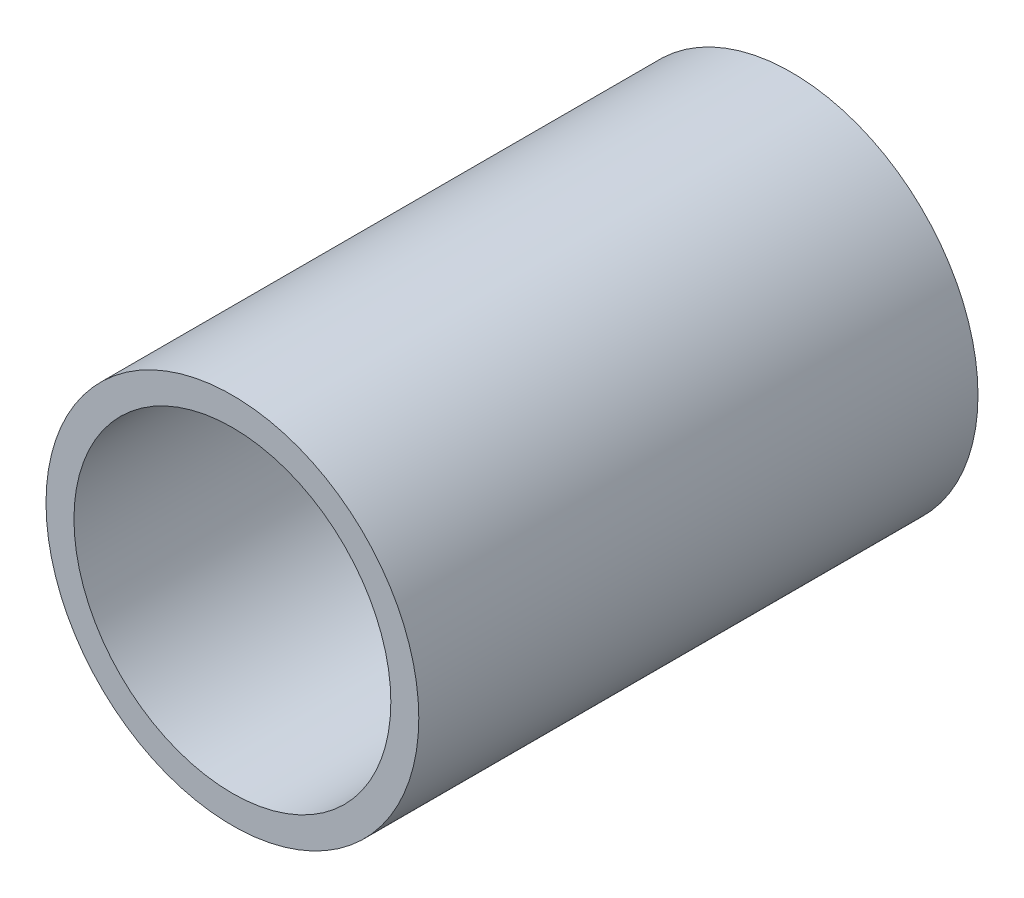
ISO-10303-21;
HEADER;
FILE_DESCRIPTION(('STEP AP214'),'2;1');
FILE_NAME('part.step','',(''),(''),'','','');
FILE_SCHEMA(('AUTOMOTIVE_DESIGN { 1 0 10303 214 1 1 1 1 }'));
ENDSEC;
DATA;
#1=APPLICATION_CONTEXT('core data for automotive mechanical design processes');
#2=APPLICATION_PROTOCOL_DEFINITION('international standard','automotive_design',2000,#1);
#3=PRODUCT_CONTEXT('',#1,'mechanical');
#4=PRODUCT('Part','Part','',(#3));
#5=PRODUCT_RELATED_PRODUCT_CATEGORY('part','',(#4));
#6=PRODUCT_DEFINITION_FORMATION('','',#4);
#7=PRODUCT_DEFINITION_CONTEXT('part definition',#1,'design');
#8=PRODUCT_DEFINITION('design','',#6,#7);
#9=PRODUCT_DEFINITION_SHAPE('','',#8);
#10=(LENGTH_UNIT() NAMED_UNIT(*) SI_UNIT(.MILLI.,.METRE.));
#11=(NAMED_UNIT(*) PLANE_ANGLE_UNIT() SI_UNIT($,.RADIAN.));
#12=(NAMED_UNIT(*) SI_UNIT($,.STERADIAN.) SOLID_ANGLE_UNIT());
#13=UNCERTAINTY_MEASURE_WITH_UNIT(LENGTH_MEASURE(1.E-05),#10,'distance_accuracy_value','');
#14=(GEOMETRIC_REPRESENTATION_CONTEXT(3) GLOBAL_UNCERTAINTY_ASSIGNED_CONTEXT((#13)) GLOBAL_UNIT_ASSIGNED_CONTEXT((#10,
#11,#12)) REPRESENTATION_CONTEXT('',''));
#15=CARTESIAN_POINT('',(0.,0.,0.));
#16=DIRECTION('',(0.,0.,1.));
#17=DIRECTION('',(1.,0.,0.));
#18=AXIS2_PLACEMENT_3D('',#15,#16,#17);
#19=CARTESIAN_POINT('',(0.,0.,-150.));
#20=DIRECTION('',(0.,0.,1.));
#21=DIRECTION('',(1.,0.,0.));
#22=AXIS2_PLACEMENT_3D('',#19,#20,#21);
#23=CYLINDRICAL_SURFACE('',#22,100.);
#24=CARTESIAN_POINT('',(0.,0.,-150.));
#25=DIRECTION('',(0.,0.,1.));
#26=DIRECTION('',(1.,0.,0.));
#27=AXIS2_PLACEMENT_3D('',#24,#25,#26);
#28=CIRCLE('',#27,100.);
#29=CARTESIAN_POINT('',(100.,0.,-150.));
#30=VERTEX_POINT('',#29);
#31=EDGE_CURVE('E10',#30,#30,#28,.T.);
#32=ORIENTED_EDGE('',*,*,#31,.T.);
#33=EDGE_LOOP('',(#32));
#34=FACE_BOUND('',#33,.T.);
#35=CARTESIAN_POINT('',(0.,0.,150.));
#36=DIRECTION('',(0.,0.,1.));
#37=DIRECTION('',(1.,0.,0.));
#38=AXIS2_PLACEMENT_3D('',#35,#36,#37);
#39=CIRCLE('',#38,100.);
#40=CARTESIAN_POINT('',(100.,0.,150.));
#41=VERTEX_POINT('',#40);
#42=EDGE_CURVE('E39',#41,#41,#39,.T.);
#43=ORIENTED_EDGE('',*,*,#42,.F.);
#44=EDGE_LOOP('',(#43));
#45=FACE_BOUND('',#44,.T.);
#46=ADVANCED_FACE('F33',(#34,#45),#23,.T.);
#47=CARTESIAN_POINT('',(0.,0.,-150.));
#48=DIRECTION('',(0.,0.,1.));
#49=DIRECTION('',(1.,0.,0.));
#50=AXIS2_PLACEMENT_3D('',#47,#48,#49);
#51=PLANE('',#50);
#52=CARTESIAN_POINT('',(0.,0.,-150.));
#53=DIRECTION('',(0.,0.,1.));
#54=DIRECTION('',(1.,0.,0.));
#55=AXIS2_PLACEMENT_3D('',#52,#53,#54);
#56=CIRCLE('',#55,85.);
#57=CARTESIAN_POINT('',(85.,0.,-150.));
#58=VERTEX_POINT('',#57);
#59=EDGE_CURVE('E43',#58,#58,#56,.T.);
#60=ORIENTED_EDGE('',*,*,#59,.T.);
#61=EDGE_LOOP('',(#60));
#62=FACE_BOUND('',#61,.T.);
#63=ORIENTED_EDGE('',*,*,#31,.F.);
#64=EDGE_LOOP('',(#63));
#65=FACE_BOUND('',#64,.T.);
#66=ADVANCED_FACE('F58',(#62,#65),#51,.F.);
#67=CARTESIAN_POINT('',(0.,0.,150.));
#68=DIRECTION('',(0.,0.,1.));
#69=DIRECTION('',(1.,0.,0.));
#70=AXIS2_PLACEMENT_3D('',#67,#68,#69);
#71=PLANE('',#70);
#72=CARTESIAN_POINT('',(0.,0.,150.));
#73=DIRECTION('',(0.,0.,1.));
#74=DIRECTION('',(1.,0.,0.));
#75=AXIS2_PLACEMENT_3D('',#72,#73,#74);
#76=CIRCLE('',#75,85.);
#77=CARTESIAN_POINT('',(85.,0.,150.));
#78=VERTEX_POINT('',#77);
#79=EDGE_CURVE('E47',#78,#78,#76,.T.);
#80=ORIENTED_EDGE('',*,*,#79,.F.);
#81=EDGE_LOOP('',(#80));
#82=FACE_BOUND('',#81,.T.);
#83=ORIENTED_EDGE('',*,*,#42,.T.);
#84=EDGE_LOOP('',(#83));
#85=FACE_BOUND('',#84,.T.);
#86=ADVANCED_FACE('F56',(#82,#85),#71,.T.);
#87=CARTESIAN_POINT('',(0.,0.,-180.));
#88=DIRECTION('',(0.,0.,1.));
#89=DIRECTION('',(1.,0.,0.));
#90=AXIS2_PLACEMENT_3D('',#87,#88,#89);
#91=CYLINDRICAL_SURFACE('',#90,85.);
#92=CARTESIAN_POINT('',(85.,0.,150.));
#93=CARTESIAN_POINT('',(85.,0.,146.875));
#94=CARTESIAN_POINT('',(85.,0.,143.75));
#95=CARTESIAN_POINT('',(85.,0.,137.5));
#96=CARTESIAN_POINT('',(85.,0.,134.375));
#97=CARTESIAN_POINT('',(85.,0.,128.125));
#98=CARTESIAN_POINT('',(85.,0.,125.));
#99=CARTESIAN_POINT('',(85.,0.,118.75));
#100=CARTESIAN_POINT('',(85.,0.,115.625));
#101=CARTESIAN_POINT('',(85.,0.,109.375));
#102=CARTESIAN_POINT('',(85.,0.,106.25));
#103=CARTESIAN_POINT('',(85.,0.,100.));
#104=CARTESIAN_POINT('',(85.,0.,96.875));
#105=CARTESIAN_POINT('',(85.,0.,90.625));
#106=CARTESIAN_POINT('',(85.,0.,87.5));
#107=CARTESIAN_POINT('',(85.,0.,81.25));
#108=CARTESIAN_POINT('',(85.,0.,78.125));
#109=CARTESIAN_POINT('',(85.,0.,71.875));
#110=CARTESIAN_POINT('',(85.,0.,68.75));
#111=CARTESIAN_POINT('',(85.,0.,62.5));
#112=CARTESIAN_POINT('',(85.,0.,59.375));
#113=CARTESIAN_POINT('',(85.,0.,53.125));
#114=CARTESIAN_POINT('',(85.,0.,50.));
#115=CARTESIAN_POINT('',(85.,0.,43.75));
#116=CARTESIAN_POINT('',(85.,0.,40.625));
#117=CARTESIAN_POINT('',(85.,0.,34.375));
#118=CARTESIAN_POINT('',(85.,0.,31.25));
#119=CARTESIAN_POINT('',(85.,0.,25.));
#120=CARTESIAN_POINT('',(85.,0.,21.875));
#121=CARTESIAN_POINT('',(85.,0.,15.625));
#122=CARTESIAN_POINT('',(85.,0.,12.5));
#123=CARTESIAN_POINT('',(85.,0.,6.25));
#124=CARTESIAN_POINT('',(85.,0.,3.125));
#125=CARTESIAN_POINT('',(85.,0.,-3.125));
#126=CARTESIAN_POINT('',(85.,0.,-6.25));
#127=CARTESIAN_POINT('',(85.,0.,-12.5));
#128=CARTESIAN_POINT('',(85.,0.,-15.625));
#129=CARTESIAN_POINT('',(85.,0.,-21.875));
#130=CARTESIAN_POINT('',(85.,0.,-25.));
#131=CARTESIAN_POINT('',(85.,0.,-31.25));
#132=CARTESIAN_POINT('',(85.,0.,-34.375));
#133=CARTESIAN_POINT('',(85.,0.,-40.625));
#134=CARTESIAN_POINT('',(85.,0.,-43.75));
#135=CARTESIAN_POINT('',(85.,0.,-50.));
#136=CARTESIAN_POINT('',(85.,0.,-53.125));
#137=CARTESIAN_POINT('',(85.,0.,-59.375));
#138=CARTESIAN_POINT('',(85.,0.,-62.5));
#139=CARTESIAN_POINT('',(85.,0.,-68.75));
#140=CARTESIAN_POINT('',(85.,0.,-71.875));
#141=CARTESIAN_POINT('',(85.,0.,-78.125));
#142=CARTESIAN_POINT('',(85.,0.,-81.25));
#143=CARTESIAN_POINT('',(85.,0.,-87.5));
#144=CARTESIAN_POINT('',(85.,0.,-90.625));
#145=CARTESIAN_POINT('',(85.,0.,-96.875));
#146=CARTESIAN_POINT('',(85.,0.,-100.));
#147=CARTESIAN_POINT('',(85.,0.,-106.25));
#148=CARTESIAN_POINT('',(85.,0.,-109.375));
#149=CARTESIAN_POINT('',(85.,0.,-115.625));
#150=CARTESIAN_POINT('',(85.,0.,-118.75));
#151=CARTESIAN_POINT('',(85.,0.,-125.));
#152=CARTESIAN_POINT('',(85.,0.,-128.125));
#153=CARTESIAN_POINT('',(85.,0.,-134.375));
#154=CARTESIAN_POINT('',(85.,0.,-137.5));
#155=CARTESIAN_POINT('',(85.,0.,-143.75));
#156=CARTESIAN_POINT('',(85.,0.,-146.875));
#157=CARTESIAN_POINT('',(85.,0.,-150.));
#158=B_SPLINE_CURVE_WITH_KNOTS('',3,(#92,#93,#94,#95,#96,#97,#98,#99,#100,#101,#102,#103,#104,
#105,#106,#107,#108,#109,#110,#111,#112,#113,#114,#115,#116,#117,#118,#119,#120,#121,#122,#123,
#124,#125,#126,#127,#128,#129,#130,#131,#132,#133,#134,#135,#136,#137,#138,#139,#140,#141,#142,
#143,#144,#145,#146,#147,#148,#149,#150,#151,#152,#153,#154,#155,#156,#157),.UNSPECIFIED.,.F.,
.F.,(4,2,2,2,2,2,2,2,2,2,2,2,2,2,2,2,2,2,2,2,2,2,2,2,2,2,2,2,2,2,2,2,4),(0.,9.37500000000002,
18.75,28.125,37.5,46.875,56.25,65.625,75.,84.375,93.75,103.125,112.5,121.875,131.25,140.625,
150.,159.375,168.75,178.125,187.5,196.875,206.25,215.625,225.,234.375,243.75,253.125,262.5,
271.875,281.25,290.625,300.),.UNSPECIFIED.);
#159=EDGE_CURVE('BSEAM53',#78,#58,#158,.T.);
#160=ORIENTED_EDGE('',*,*,#79,.T.);
#161=ORIENTED_EDGE('',*,*,#59,.F.);
#162=ORIENTED_EDGE('',*,*,#159,.T.);
#163=ORIENTED_EDGE('',*,*,#159,.F.);
#164=EDGE_LOOP('',(#160,#162,#161,#163));
#165=FACE_BOUND('',#164,.T.);
#166=ADVANCED_FACE('F53',(#165),#91,.F.);
#167=CLOSED_SHELL('',(#46,#66,#86,#166));
#168=MANIFOLD_SOLID_BREP('B2',#167);
#169=ADVANCED_BREP_SHAPE_REPRESENTATION('',(#18,#168),#14);
#170=SHAPE_DEFINITION_REPRESENTATION(#9,#169);
ENDSEC;
END-ISO-10303-21;
